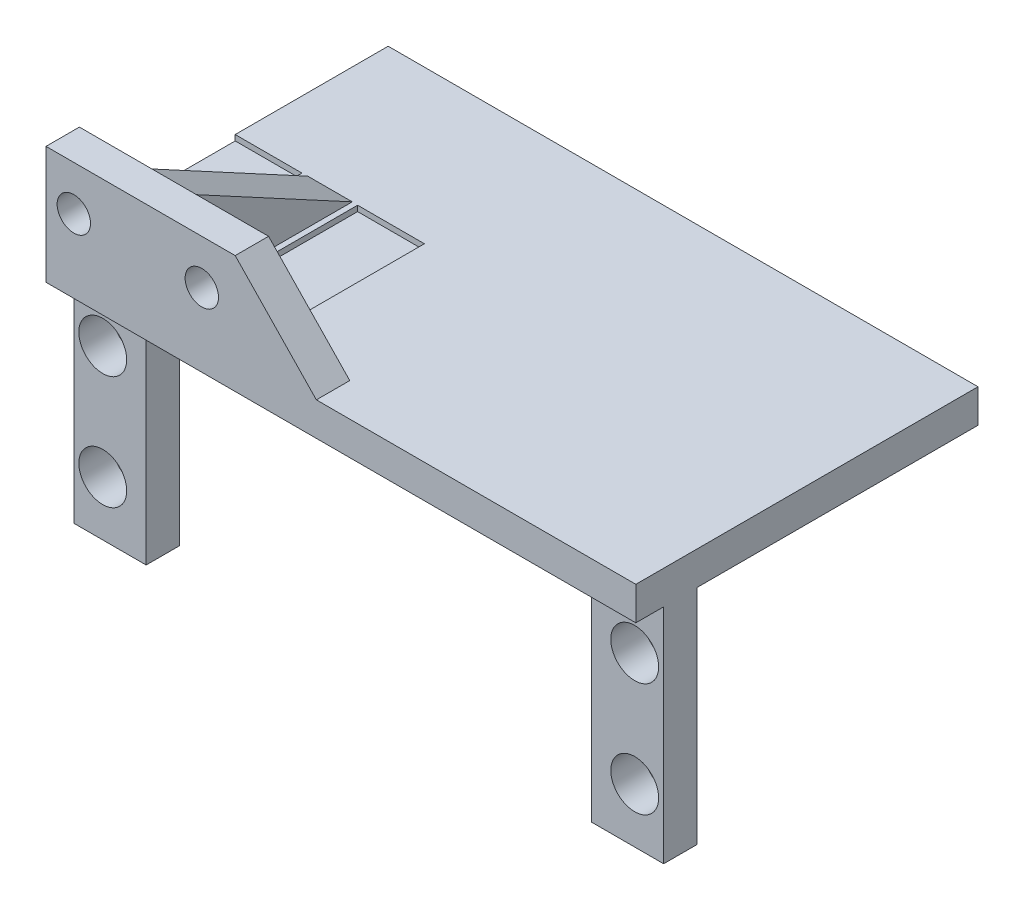
ISO-10303-21;
HEADER;
FILE_DESCRIPTION(('STEP AP214'),'2;1');
FILE_NAME('part.step','',(''),(''),'','','');
FILE_SCHEMA(('AUTOMOTIVE_DESIGN { 1 0 10303 214 1 1 1 1 }'));
ENDSEC;
DATA;
#1=APPLICATION_CONTEXT('core data for automotive mechanical design processes');
#2=APPLICATION_PROTOCOL_DEFINITION('international standard','automotive_design',2000,#1);
#3=PRODUCT_CONTEXT('',#1,'mechanical');
#4=PRODUCT('Part','Part','',(#3));
#5=PRODUCT_RELATED_PRODUCT_CATEGORY('part','',(#4));
#6=PRODUCT_DEFINITION_FORMATION('','',#4);
#7=PRODUCT_DEFINITION_CONTEXT('part definition',#1,'design');
#8=PRODUCT_DEFINITION('design','',#6,#7);
#9=PRODUCT_DEFINITION_SHAPE('','',#8);
#10=(LENGTH_UNIT() NAMED_UNIT(*) SI_UNIT(.MILLI.,.METRE.));
#11=(NAMED_UNIT(*) PLANE_ANGLE_UNIT() SI_UNIT($,.RADIAN.));
#12=(NAMED_UNIT(*) SI_UNIT($,.STERADIAN.) SOLID_ANGLE_UNIT());
#13=UNCERTAINTY_MEASURE_WITH_UNIT(LENGTH_MEASURE(1.E-05),#10,'distance_accuracy_value','');
#14=(GEOMETRIC_REPRESENTATION_CONTEXT(3) GLOBAL_UNCERTAINTY_ASSIGNED_CONTEXT((#13)) GLOBAL_UNIT_ASSIGNED_CONTEXT((#10,
#11,#12)) REPRESENTATION_CONTEXT('',''));
#15=CARTESIAN_POINT('',(0.,0.,0.));
#16=DIRECTION('',(0.,0.,1.));
#17=DIRECTION('',(1.,0.,0.));
#18=AXIS2_PLACEMENT_3D('',#15,#16,#17);
#19=CARTESIAN_POINT('',(0.,3.,0.));
#20=DIRECTION('',(0.,1.,0.));
#21=DIRECTION('',(0.,0.,1.));
#22=AXIS2_PLACEMENT_3D('',#19,#20,#21);
#23=PLANE('',#22);
#24=DIRECTION('',(0.,0.,1.));
#25=VECTOR('',#24,1.);
#26=CARTESIAN_POINT('',(21.9121082102589,3.,34.4908925903216));
#27=LINE('',#26,#25);
#28=CARTESIAN_POINT('',(21.9121082102589,3.,34.4908925903216));
#29=VERTEX_POINT('',#28);
#30=CARTESIAN_POINT('',(21.9121082102589,3.,37.4908925903216));
#31=VERTEX_POINT('',#30);
#32=EDGE_CURVE('E55',#29,#31,#27,.T.);
#33=ORIENTED_EDGE('',*,*,#32,.T.);
#34=DIRECTION('',(1.,0.,0.));
#35=VECTOR('',#34,1.);
#36=CARTESIAN_POINT('',(-2.38191084480889,3.,37.4908925903216));
#37=LINE('',#36,#35);
#38=CARTESIAN_POINT('',(50.6180891551911,3.,37.4908925903216));
#39=VERTEX_POINT('',#38);
#40=EDGE_CURVE('E403',#31,#39,#37,.T.);
#41=ORIENTED_EDGE('',*,*,#40,.T.);
#42=DIRECTION('',(0.,0.,-1.));
#43=VECTOR('',#42,1.);
#44=CARTESIAN_POINT('',(50.6180891551911,3.,6.74530636270987));
#45=LINE('',#44,#43);
#46=CARTESIAN_POINT('',(50.6180891551911,3.,6.74530636270987));
#47=VERTEX_POINT('',#46);
#48=EDGE_CURVE('E406',#39,#47,#45,.T.);
#49=ORIENTED_EDGE('',*,*,#48,.T.);
#50=DIRECTION('',(-1.,0.,0.));
#51=VECTOR('',#50,1.);
#52=CARTESIAN_POINT('',(-2.3819108448089,3.,6.74530636270987));
#53=LINE('',#52,#51);
#54=CARTESIAN_POINT('',(-2.3819108448089,3.,6.74530636270987));
#55=VERTEX_POINT('',#54);
#56=EDGE_CURVE('E408',#47,#55,#53,.T.);
#57=ORIENTED_EDGE('',*,*,#56,.T.);
#58=DIRECTION('',(0.,0.,1.));
#59=VECTOR('',#58,1.);
#60=CARTESIAN_POINT('',(-2.3819108448089,3.,6.74530636270987));
#61=LINE('',#60,#59);
#62=CARTESIAN_POINT('',(-2.3819108448089,3.,20.4908925903216));
#63=VERTEX_POINT('',#62);
#64=EDGE_CURVE('E400',#55,#63,#61,.T.);
#65=ORIENTED_EDGE('',*,*,#64,.T.);
#66=DIRECTION('',(1.,0.,0.));
#67=VECTOR('',#66,1.);
#68=CARTESIAN_POINT('',(0.,3.,20.4908925903216));
#69=LINE('',#68,#67);
#70=CARTESIAN_POINT('',(3.6180891551911,3.,20.4908925903216));
#71=VERTEX_POINT('',#70);
#72=EDGE_CURVE('E289',#63,#71,#69,.T.);
#73=ORIENTED_EDGE('',*,*,#72,.T.);
#74=DIRECTION('',(0.,0.,-1.));
#75=VECTOR('',#74,1.);
#76=CARTESIAN_POINT('',(3.6180891551911,3.,0.));
#77=LINE('',#76,#75);
#78=CARTESIAN_POINT('',(3.6180891551911,3.,34.4908925903216));
#79=VERTEX_POINT('',#78);
#80=EDGE_CURVE('E252',#79,#71,#77,.T.);
#81=ORIENTED_EDGE('',*,*,#80,.F.);
#82=DIRECTION('',(1.,0.,0.));
#83=VECTOR('',#82,1.);
#84=CARTESIAN_POINT('',(-2.38191084480889,3.,34.4908925903216));
#85=LINE('',#84,#83);
#86=CARTESIAN_POINT('',(4.11808915519111,3.,34.4908925903216));
#87=VERTEX_POINT('',#86);
#88=EDGE_CURVE('E215',#79,#87,#85,.T.);
#89=ORIENTED_EDGE('',*,*,#88,.T.);
#90=DIRECTION('',(0.,0.,1.));
#91=VECTOR('',#90,1.);
#92=CARTESIAN_POINT('',(4.11808915519111,3.,34.4908925903216));
#93=LINE('',#92,#91);
#94=CARTESIAN_POINT('',(4.1180891551911,3.,20.4689209894298));
#95=VERTEX_POINT('',#94);
#96=EDGE_CURVE('E236',#95,#87,#93,.T.);
#97=ORIENTED_EDGE('',*,*,#96,.F.);
#98=DIRECTION('',(-1.,0.,0.));
#99=VECTOR('',#98,1.);
#100=CARTESIAN_POINT('',(8.11808915519111,3.,20.4689209894298));
#101=LINE('',#100,#99);
#102=CARTESIAN_POINT('',(8.11808915519111,3.,20.4689209894298));
#103=VERTEX_POINT('',#102);
#104=EDGE_CURVE('E248',#103,#95,#101,.T.);
#105=ORIENTED_EDGE('',*,*,#104,.F.);
#106=DIRECTION('',(0.,0.,1.));
#107=VECTOR('',#106,1.);
#108=CARTESIAN_POINT('',(8.11808915519111,3.,34.4908925903216));
#109=LINE('',#108,#107);
#110=CARTESIAN_POINT('',(8.11808915519111,3.,34.4908925903216));
#111=VERTEX_POINT('',#110);
#112=EDGE_CURVE('E243',#103,#111,#109,.T.);
#113=ORIENTED_EDGE('',*,*,#112,.T.);
#114=CARTESIAN_POINT('',(8.61808915519111,3.,34.4908925903216));
#115=VERTEX_POINT('',#114);
#116=EDGE_CURVE('E314',#111,#115,#85,.T.);
#117=ORIENTED_EDGE('',*,*,#116,.T.);
#118=DIRECTION('',(0.,0.,-1.));
#119=VECTOR('',#118,1.);
#120=CARTESIAN_POINT('',(8.61808915519111,3.,0.));
#121=LINE('',#120,#119);
#122=CARTESIAN_POINT('',(8.61808915519111,3.,20.4908925903216));
#123=VERTEX_POINT('',#122);
#124=EDGE_CURVE('E267',#115,#123,#121,.T.);
#125=ORIENTED_EDGE('',*,*,#124,.T.);
#126=DIRECTION('',(-1.,0.,0.));
#127=VECTOR('',#126,1.);
#128=CARTESIAN_POINT('',(0.,3.,20.4908925903216));
#129=LINE('',#128,#127);
#130=CARTESIAN_POINT('',(14.6180891551911,3.,20.4908925903216));
#131=VERTEX_POINT('',#130);
#132=EDGE_CURVE('E257',#131,#123,#129,.T.);
#133=ORIENTED_EDGE('',*,*,#132,.F.);
#134=DIRECTION('',(0.,0.,-1.));
#135=VECTOR('',#134,1.);
#136=CARTESIAN_POINT('',(14.6180891551911,3.,0.));
#137=LINE('',#136,#135);
#138=CARTESIAN_POINT('',(14.6180891551911,3.,34.4908925903216));
#139=VERTEX_POINT('',#138);
#140=EDGE_CURVE('E270',#139,#131,#137,.T.);
#141=ORIENTED_EDGE('',*,*,#140,.F.);
#142=DIRECTION('',(1.,0.,0.));
#143=VECTOR('',#142,1.);
#144=CARTESIAN_POINT('',(14.6180891551911,3.,34.4908925903216));
#145=LINE('',#144,#143);
#146=EDGE_CURVE('E51',#139,#29,#145,.T.);
#147=ORIENTED_EDGE('',*,*,#146,.T.);
#148=EDGE_LOOP('',(#33,#41,#49,#57,#65,#73,#81,#89,#97,#105,#113,#117,#125,#133,#141,#147));
#149=FACE_BOUND('',#148,.T.);
#150=ADVANCED_FACE('F34',(#149),#23,.T.);
#151=CARTESIAN_POINT('',(0.,0.,0.));
#152=DIRECTION('',(0.,1.,0.));
#153=DIRECTION('',(0.,0.,1.));
#154=AXIS2_PLACEMENT_3D('',#151,#152,#153);
#155=PLANE('',#154);
#156=DIRECTION('',(-1.,0.,0.));
#157=VECTOR('',#156,1.);
#158=CARTESIAN_POINT('',(4.11808915519112,0.,34.9908925903216));
#159=LINE('',#158,#157);
#160=CARTESIAN_POINT('',(4.11808915519112,0.,34.9908925903216));
#161=VERTEX_POINT('',#160);
#162=CARTESIAN_POINT('',(-2.38191084480889,0.,34.9908925903216));
#163=VERTEX_POINT('',#162);
#164=EDGE_CURVE('E357',#161,#163,#159,.T.);
#165=ORIENTED_EDGE('',*,*,#164,.F.);
#166=DIRECTION('',(0.,0.,1.));
#167=VECTOR('',#166,1.);
#168=CARTESIAN_POINT('',(4.11808915519112,0.,34.9908925903216));
#169=LINE('',#168,#167);
#170=CARTESIAN_POINT('',(4.11808915519112,0.,31.9908925903216));
#171=VERTEX_POINT('',#170);
#172=EDGE_CURVE('E341',#171,#161,#169,.T.);
#173=ORIENTED_EDGE('',*,*,#172,.F.);
#174=DIRECTION('',(1.,0.,0.));
#175=VECTOR('',#174,1.);
#176=CARTESIAN_POINT('',(4.11808915519112,0.,31.9908925903216));
#177=LINE('',#176,#175);
#178=CARTESIAN_POINT('',(-2.38191084480889,0.,31.9908925903216));
#179=VERTEX_POINT('',#178);
#180=EDGE_CURVE('E348',#179,#171,#177,.T.);
#181=ORIENTED_EDGE('',*,*,#180,.F.);
#182=DIRECTION('',(0.,0.,1.));
#183=VECTOR('',#182,1.);
#184=CARTESIAN_POINT('',(-2.3819108448089,0.,6.74530636270987));
#185=LINE('',#184,#183);
#186=CARTESIAN_POINT('',(-2.3819108448089,0.,6.74530636270987));
#187=VERTEX_POINT('',#186);
#188=EDGE_CURVE('E411',#187,#179,#185,.T.);
#189=ORIENTED_EDGE('',*,*,#188,.F.);
#190=DIRECTION('',(-1.,0.,0.));
#191=VECTOR('',#190,1.);
#192=CARTESIAN_POINT('',(-2.3819108448089,0.,6.74530636270987));
#193=LINE('',#192,#191);
#194=CARTESIAN_POINT('',(50.6180891551911,0.,6.74530636270987));
#195=VERTEX_POINT('',#194);
#196=EDGE_CURVE('E404',#195,#187,#193,.T.);
#197=ORIENTED_EDGE('',*,*,#196,.F.);
#198=DIRECTION('',(0.,0.,-1.));
#199=VECTOR('',#198,1.);
#200=CARTESIAN_POINT('',(50.6180891551911,0.,6.74530636270987));
#201=LINE('',#200,#199);
#202=CARTESIAN_POINT('',(50.6180891551911,0.,31.9908925903216));
#203=VERTEX_POINT('',#202);
#204=EDGE_CURVE('E416',#203,#195,#201,.T.);
#205=ORIENTED_EDGE('',*,*,#204,.F.);
#206=DIRECTION('',(1.,0.,0.));
#207=VECTOR('',#206,1.);
#208=CARTESIAN_POINT('',(50.6180891551911,0.,31.9908925903216));
#209=LINE('',#208,#207);
#210=CARTESIAN_POINT('',(44.1180891551911,0.,31.9908925903216));
#211=VERTEX_POINT('',#210);
#212=EDGE_CURVE('E374',#211,#203,#209,.T.);
#213=ORIENTED_EDGE('',*,*,#212,.F.);
#214=DIRECTION('',(0.,0.,-1.));
#215=VECTOR('',#214,1.);
#216=CARTESIAN_POINT('',(44.1180891551911,0.,34.9908925903216));
#217=LINE('',#216,#215);
#218=CARTESIAN_POINT('',(44.1180891551911,0.,34.9908925903216));
#219=VERTEX_POINT('',#218);
#220=EDGE_CURVE('E383',#219,#211,#217,.T.);
#221=ORIENTED_EDGE('',*,*,#220,.F.);
#222=DIRECTION('',(-1.,0.,0.));
#223=VECTOR('',#222,1.);
#224=CARTESIAN_POINT('',(50.6180891551911,0.,34.9908925903216));
#225=LINE('',#224,#223);
#226=CARTESIAN_POINT('',(50.6180891551911,0.,34.9908925903216));
#227=VERTEX_POINT('',#226);
#228=EDGE_CURVE('E369',#227,#219,#225,.T.);
#229=ORIENTED_EDGE('',*,*,#228,.F.);
#230=CARTESIAN_POINT('',(50.6180891551911,0.,37.4908925903216));
#231=VERTEX_POINT('',#230);
#232=EDGE_CURVE('E417',#231,#227,#201,.T.);
#233=ORIENTED_EDGE('',*,*,#232,.F.);
#234=DIRECTION('',(1.,0.,0.));
#235=VECTOR('',#234,1.);
#236=CARTESIAN_POINT('',(-2.38191084480889,0.,37.4908925903216));
#237=LINE('',#236,#235);
#238=CARTESIAN_POINT('',(-2.38191084480889,0.,37.4908925903216));
#239=VERTEX_POINT('',#238);
#240=EDGE_CURVE('E414',#239,#231,#237,.T.);
#241=ORIENTED_EDGE('',*,*,#240,.F.);
#242=EDGE_CURVE('E399',#163,#239,#185,.T.);
#243=ORIENTED_EDGE('',*,*,#242,.F.);
#244=EDGE_LOOP('',(#165,#173,#181,#189,#197,#205,#213,#221,#229,#233,#241,#243));
#245=FACE_BOUND('',#244,.T.);
#246=ADVANCED_FACE('F447',(#245),#155,.F.);
#247=CARTESIAN_POINT('',(-2.3819108448089,3.,6.74530636270987));
#248=DIRECTION('',(1.,0.,0.));
#249=DIRECTION('',(0.,0.,-1.));
#250=AXIS2_PLACEMENT_3D('',#247,#248,#249);
#251=PLANE('',#250);
#252=DIRECTION('',(0.,-1.,0.));
#253=VECTOR('',#252,1.);
#254=CARTESIAN_POINT('',(-2.38191084480889,3.,34.4908925903216));
#255=LINE('',#254,#253);
#256=CARTESIAN_POINT('',(-2.38191084480889,10.58,34.4908925903216));
#257=VERTEX_POINT('',#256);
#258=CARTESIAN_POINT('',(-2.38191084480889,2.5,34.4908925903216));
#259=VERTEX_POINT('',#258);
#260=EDGE_CURVE('E211',#257,#259,#255,.T.);
#261=ORIENTED_EDGE('',*,*,#260,.T.);
#262=DIRECTION('',(0.,0.,1.));
#263=VECTOR('',#262,1.);
#264=CARTESIAN_POINT('',(-2.3819108448089,2.5,0.));
#265=LINE('',#264,#263);
#266=CARTESIAN_POINT('',(-2.3819108448089,2.5,20.4908925903216));
#267=VERTEX_POINT('',#266);
#268=EDGE_CURVE('E294',#267,#259,#265,.T.);
#269=ORIENTED_EDGE('',*,*,#268,.F.);
#270=DIRECTION('',(0.,1.,0.));
#271=VECTOR('',#270,1.);
#272=CARTESIAN_POINT('',(-2.3819108448089,2.5,20.4908925903216));
#273=LINE('',#272,#271);
#274=EDGE_CURVE('E271',#267,#63,#273,.T.);
#275=ORIENTED_EDGE('',*,*,#274,.T.);
#276=ORIENTED_EDGE('',*,*,#64,.F.);
#277=DIRECTION('',(0.,-1.,0.));
#278=VECTOR('',#277,1.);
#279=CARTESIAN_POINT('',(-2.3819108448089,3.,6.74530636270987));
#280=LINE('',#279,#278);
#281=EDGE_CURVE('E410',#55,#187,#280,.T.);
#282=ORIENTED_EDGE('',*,*,#281,.T.);
#283=ORIENTED_EDGE('',*,*,#188,.T.);
#284=DIRECTION('',(0.,1.,0.));
#285=VECTOR('',#284,1.);
#286=CARTESIAN_POINT('',(-2.38191084480889,-20.,31.9908925903216));
#287=LINE('',#286,#285);
#288=CARTESIAN_POINT('',(-2.38191084480889,-20.,31.9908925903216));
#289=VERTEX_POINT('',#288);
#290=EDGE_CURVE('E363',#289,#179,#287,.T.);
#291=ORIENTED_EDGE('',*,*,#290,.F.);
#292=DIRECTION('',(0.,0.,-1.));
#293=VECTOR('',#292,1.);
#294=CARTESIAN_POINT('',(-2.38191084480889,-20.,34.9908925903216));
#295=LINE('',#294,#293);
#296=CARTESIAN_POINT('',(-2.38191084480889,-20.,34.9908925903216));
#297=VERTEX_POINT('',#296);
#298=EDGE_CURVE('E350',#297,#289,#295,.T.);
#299=ORIENTED_EDGE('',*,*,#298,.F.);
#300=DIRECTION('',(0.,1.,0.));
#301=VECTOR('',#300,1.);
#302=CARTESIAN_POINT('',(-2.38191084480889,-20.,34.9908925903216));
#303=LINE('',#302,#301);
#304=EDGE_CURVE('E365',#297,#163,#303,.T.);
#305=ORIENTED_EDGE('',*,*,#304,.T.);
#306=ORIENTED_EDGE('',*,*,#242,.T.);
#307=DIRECTION('',(0.,-1.,0.));
#308=VECTOR('',#307,1.);
#309=CARTESIAN_POINT('',(-2.38191084480889,3.,37.4908925903216));
#310=LINE('',#309,#308);
#311=CARTESIAN_POINT('',(-2.38191084480889,10.58,37.4908925903216));
#312=VERTEX_POINT('',#311);
#313=EDGE_CURVE('E11',#312,#239,#310,.T.);
#314=ORIENTED_EDGE('',*,*,#313,.F.);
#315=DIRECTION('',(0.,0.,1.));
#316=VECTOR('',#315,1.);
#317=CARTESIAN_POINT('',(-2.38191084480889,10.58,34.4908925903216));
#318=LINE('',#317,#316);
#319=EDGE_CURVE('E224',#257,#312,#318,.T.);
#320=ORIENTED_EDGE('',*,*,#319,.F.);
#321=EDGE_LOOP('',(#261,#269,#275,#276,#282,#283,#291,#299,#305,#306,#314,#320));
#322=FACE_BOUND('',#321,.T.);
#323=ADVANCED_FACE('F36',(#322),#251,.F.);
#324=CARTESIAN_POINT('',(-2.38191084480889,3.,37.4908925903216));
#325=DIRECTION('',(0.,0.,-1.));
#326=DIRECTION('',(-1.,0.,0.));
#327=AXIS2_PLACEMENT_3D('',#324,#325,#326);
#328=PLANE('',#327);
#329=ORIENTED_EDGE('',*,*,#40,.F.);
#330=DIRECTION('',(-0.693383174984069,0.72056906167904,0.));
#331=VECTOR('',#330,1.);
#332=CARTESIAN_POINT('',(21.9121082102589,3.,37.4908925903216));
#333=LINE('',#332,#331);
#334=CARTESIAN_POINT('',(14.6180891551911,10.58,37.4908925903216));
#335=VERTEX_POINT('',#334);
#336=EDGE_CURVE('E230',#31,#335,#333,.T.);
#337=ORIENTED_EDGE('',*,*,#336,.T.);
#338=DIRECTION('',(-1.,0.,0.));
#339=VECTOR('',#338,1.);
#340=CARTESIAN_POINT('',(-2.38191084480889,10.58,37.4908925903216));
#341=LINE('',#340,#339);
#342=EDGE_CURVE('E220',#335,#312,#341,.T.);
#343=ORIENTED_EDGE('',*,*,#342,.T.);
#344=ORIENTED_EDGE('',*,*,#313,.T.);
#345=ORIENTED_EDGE('',*,*,#240,.T.);
#346=DIRECTION('',(0.,-1.,0.));
#347=VECTOR('',#346,1.);
#348=CARTESIAN_POINT('',(50.6180891551911,3.,37.4908925903216));
#349=LINE('',#348,#347);
#350=EDGE_CURVE('E43',#39,#231,#349,.T.);
#351=ORIENTED_EDGE('',*,*,#350,.F.);
#352=EDGE_LOOP('',(#329,#337,#343,#344,#345,#351));
#353=FACE_BOUND('',#352,.T.);
#354=CARTESIAN_POINT('',(0.118089155191028,6.58,37.4908925903216));
#355=DIRECTION('',(0.,0.,1.));
#356=DIRECTION('',(1.,0.,0.));
#357=AXIS2_PLACEMENT_3D('',#354,#355,#356);
#358=CIRCLE('',#357,1.5);
#359=CARTESIAN_POINT('',(1.61808915519103,6.58,37.4908925903216));
#360=VERTEX_POINT('',#359);
#361=EDGE_CURVE('E307',#360,#360,#358,.T.);
#362=ORIENTED_EDGE('',*,*,#361,.F.);
#363=EDGE_LOOP('',(#362));
#364=FACE_BOUND('',#363,.T.);
#365=CARTESIAN_POINT('',(11.618089155191,6.58,37.4908925903216));
#366=DIRECTION('',(0.,0.,1.));
#367=DIRECTION('',(1.,0.,0.));
#368=AXIS2_PLACEMENT_3D('',#365,#366,#367);
#369=CIRCLE('',#368,1.5);
#370=CARTESIAN_POINT('',(13.118089155191,6.58,37.4908925903216));
#371=VERTEX_POINT('',#370);
#372=EDGE_CURVE('E278',#371,#371,#369,.T.);
#373=ORIENTED_EDGE('',*,*,#372,.F.);
#374=EDGE_LOOP('',(#373));
#375=FACE_BOUND('',#374,.T.);
#376=ADVANCED_FACE('F464',(#353,#364,#375),#328,.F.);
#377=CARTESIAN_POINT('',(50.6180891551911,3.,6.74530636270987));
#378=DIRECTION('',(-1.,0.,0.));
#379=DIRECTION('',(0.,0.,1.));
#380=AXIS2_PLACEMENT_3D('',#377,#378,#379);
#381=PLANE('',#380);
#382=ORIENTED_EDGE('',*,*,#232,.T.);
#383=DIRECTION('',(0.,1.,0.));
#384=VECTOR('',#383,1.);
#385=CARTESIAN_POINT('',(50.6180891551911,-20.,34.9908925903216));
#386=LINE('',#385,#384);
#387=CARTESIAN_POINT('',(50.6180891551911,-20.,34.9908925903216));
#388=VERTEX_POINT('',#387);
#389=EDGE_CURVE('E396',#388,#227,#386,.T.);
#390=ORIENTED_EDGE('',*,*,#389,.F.);
#391=DIRECTION('',(0.,0.,1.));
#392=VECTOR('',#391,1.);
#393=CARTESIAN_POINT('',(50.6180891551911,-20.,34.9908925903216));
#394=LINE('',#393,#392);
#395=CARTESIAN_POINT('',(50.6180891551911,-20.,31.9908925903216));
#396=VERTEX_POINT('',#395);
#397=EDGE_CURVE('E370',#396,#388,#394,.T.);
#398=ORIENTED_EDGE('',*,*,#397,.F.);
#399=DIRECTION('',(0.,1.,0.));
#400=VECTOR('',#399,1.);
#401=CARTESIAN_POINT('',(50.6180891551911,-20.,31.9908925903216));
#402=LINE('',#401,#400);
#403=EDGE_CURVE('E380',#396,#203,#402,.T.);
#404=ORIENTED_EDGE('',*,*,#403,.T.);
#405=ORIENTED_EDGE('',*,*,#204,.T.);
#406=DIRECTION('',(0.,-1.,0.));
#407=VECTOR('',#406,1.);
#408=CARTESIAN_POINT('',(50.6180891551911,3.,6.74530636270987));
#409=LINE('',#408,#407);
#410=EDGE_CURVE('E423',#47,#195,#409,.T.);
#411=ORIENTED_EDGE('',*,*,#410,.F.);
#412=ORIENTED_EDGE('',*,*,#48,.F.);
#413=ORIENTED_EDGE('',*,*,#350,.T.);
#414=EDGE_LOOP('',(#382,#390,#398,#404,#405,#411,#412,#413));
#415=FACE_BOUND('',#414,.T.);
#416=ADVANCED_FACE('F461',(#415),#381,.F.);
#417=CARTESIAN_POINT('',(-2.3819108448089,3.,6.74530636270987));
#418=DIRECTION('',(0.,0.,1.));
#419=DIRECTION('',(1.,0.,0.));
#420=AXIS2_PLACEMENT_3D('',#417,#418,#419);
#421=PLANE('',#420);
#422=ORIENTED_EDGE('',*,*,#196,.T.);
#423=ORIENTED_EDGE('',*,*,#281,.F.);
#424=ORIENTED_EDGE('',*,*,#56,.F.);
#425=ORIENTED_EDGE('',*,*,#410,.T.);
#426=EDGE_LOOP('',(#422,#423,#424,#425));
#427=FACE_BOUND('',#426,.T.);
#428=ADVANCED_FACE('F458',(#427),#421,.F.);
#429=CARTESIAN_POINT('',(50.6180891551911,-20.,34.9908925903216));
#430=DIRECTION('',(0.,0.,-1.));
#431=DIRECTION('',(-1.,0.,0.));
#432=AXIS2_PLACEMENT_3D('',#429,#430,#431);
#433=PLANE('',#432);
#434=CARTESIAN_POINT('',(48.0180891551911,-4.90000000000001,34.9908925903216));
#435=DIRECTION('',(0.,0.,1.));
#436=DIRECTION('',(1.,0.,0.));
#437=AXIS2_PLACEMENT_3D('',#434,#435,#436);
#438=CIRCLE('',#437,2.15);
#439=CARTESIAN_POINT('',(50.1680891551911,-4.90000000000001,34.9908925903216));
#440=VERTEX_POINT('',#439);
#441=EDGE_CURVE('E330',#440,#440,#438,.T.);
#442=ORIENTED_EDGE('',*,*,#441,.F.);
#443=EDGE_LOOP('',(#442));
#444=FACE_BOUND('',#443,.T.);
#445=CARTESIAN_POINT('',(48.0180891551911,-15.1,34.9908925903216));
#446=DIRECTION('',(0.,0.,1.));
#447=DIRECTION('',(1.,0.,0.));
#448=AXIS2_PLACEMENT_3D('',#445,#446,#447);
#449=CIRCLE('',#448,2.15);
#450=CARTESIAN_POINT('',(50.1680891551911,-15.1,34.9908925903216));
#451=VERTEX_POINT('',#450);
#452=EDGE_CURVE('E329',#451,#451,#449,.T.);
#453=ORIENTED_EDGE('',*,*,#452,.F.);
#454=EDGE_LOOP('',(#453));
#455=FACE_BOUND('',#454,.T.);
#456=ORIENTED_EDGE('',*,*,#228,.T.);
#457=DIRECTION('',(0.,1.,0.));
#458=VECTOR('',#457,1.);
#459=CARTESIAN_POINT('',(44.1180891551911,-20.,34.9908925903216));
#460=LINE('',#459,#458);
#461=CARTESIAN_POINT('',(44.1180891551911,-20.,34.9908925903216));
#462=VERTEX_POINT('',#461);
#463=EDGE_CURVE('E393',#462,#219,#460,.T.);
#464=ORIENTED_EDGE('',*,*,#463,.F.);
#465=DIRECTION('',(-1.,0.,0.));
#466=VECTOR('',#465,1.);
#467=CARTESIAN_POINT('',(50.6180891551911,-20.,34.9908925903216));
#468=LINE('',#467,#466);
#469=EDGE_CURVE('E373',#388,#462,#468,.T.);
#470=ORIENTED_EDGE('',*,*,#469,.F.);
#471=ORIENTED_EDGE('',*,*,#389,.T.);
#472=EDGE_LOOP('',(#456,#464,#470,#471));
#473=FACE_BOUND('',#472,.T.);
#474=ADVANCED_FACE('F455',(#444,#455,#473),#433,.F.);
#475=CARTESIAN_POINT('',(44.1180891551911,-20.,34.9908925903216));
#476=DIRECTION('',(1.,0.,0.));
#477=DIRECTION('',(0.,0.,-1.));
#478=AXIS2_PLACEMENT_3D('',#475,#476,#477);
#479=PLANE('',#478);
#480=ORIENTED_EDGE('',*,*,#220,.T.);
#481=DIRECTION('',(0.,1.,0.));
#482=VECTOR('',#481,1.);
#483=CARTESIAN_POINT('',(44.1180891551911,-20.,31.9908925903216));
#484=LINE('',#483,#482);
#485=CARTESIAN_POINT('',(44.1180891551911,-20.,31.9908925903216));
#486=VERTEX_POINT('',#485);
#487=EDGE_CURVE('E390',#486,#211,#484,.T.);
#488=ORIENTED_EDGE('',*,*,#487,.F.);
#489=DIRECTION('',(0.,0.,-1.));
#490=VECTOR('',#489,1.);
#491=CARTESIAN_POINT('',(44.1180891551911,-20.,34.9908925903216));
#492=LINE('',#491,#490);
#493=EDGE_CURVE('E376',#462,#486,#492,.T.);
#494=ORIENTED_EDGE('',*,*,#493,.F.);
#495=ORIENTED_EDGE('',*,*,#463,.T.);
#496=EDGE_LOOP('',(#480,#488,#494,#495));
#497=FACE_BOUND('',#496,.T.);
#498=ADVANCED_FACE('F663',(#497),#479,.F.);
#499=CARTESIAN_POINT('',(50.6180891551911,-20.,31.9908925903216));
#500=DIRECTION('',(0.,0.,1.));
#501=DIRECTION('',(1.,0.,0.));
#502=AXIS2_PLACEMENT_3D('',#499,#500,#501);
#503=PLANE('',#502);
#504=CARTESIAN_POINT('',(48.0180891551911,-4.90000000000001,31.9908925903216));
#505=DIRECTION('',(0.,0.,1.));
#506=DIRECTION('',(1.,0.,0.));
#507=AXIS2_PLACEMENT_3D('',#504,#505,#506);
#508=CIRCLE('',#507,2.15);
#509=CARTESIAN_POINT('',(50.1680891551911,-4.90000000000001,31.9908925903216));
#510=VERTEX_POINT('',#509);
#511=EDGE_CURVE('E326',#510,#510,#508,.T.);
#512=ORIENTED_EDGE('',*,*,#511,.T.);
#513=EDGE_LOOP('',(#512));
#514=FACE_BOUND('',#513,.T.);
#515=CARTESIAN_POINT('',(48.0180891551911,-15.1,31.9908925903216));
#516=DIRECTION('',(0.,0.,1.));
#517=DIRECTION('',(1.,0.,0.));
#518=AXIS2_PLACEMENT_3D('',#515,#516,#517);
#519=CIRCLE('',#518,2.15);
#520=CARTESIAN_POINT('',(50.1680891551911,-15.1,31.9908925903216));
#521=VERTEX_POINT('',#520);
#522=EDGE_CURVE('E338',#521,#521,#519,.T.);
#523=ORIENTED_EDGE('',*,*,#522,.T.);
#524=EDGE_LOOP('',(#523));
#525=FACE_BOUND('',#524,.T.);
#526=ORIENTED_EDGE('',*,*,#212,.T.);
#527=ORIENTED_EDGE('',*,*,#403,.F.);
#528=DIRECTION('',(1.,0.,0.));
#529=VECTOR('',#528,1.);
#530=CARTESIAN_POINT('',(50.6180891551911,-20.,31.9908925903216));
#531=LINE('',#530,#529);
#532=EDGE_CURVE('E378',#486,#396,#531,.T.);
#533=ORIENTED_EDGE('',*,*,#532,.F.);
#534=ORIENTED_EDGE('',*,*,#487,.T.);
#535=EDGE_LOOP('',(#526,#527,#533,#534));
#536=FACE_BOUND('',#535,.T.);
#537=ADVANCED_FACE('F657',(#514,#525,#536),#503,.F.);
#538=CARTESIAN_POINT('',(0.,-20.,0.));
#539=DIRECTION('',(0.,1.,0.));
#540=DIRECTION('',(0.,0.,1.));
#541=AXIS2_PLACEMENT_3D('',#538,#539,#540);
#542=PLANE('',#541);
#543=ORIENTED_EDGE('',*,*,#397,.T.);
#544=ORIENTED_EDGE('',*,*,#469,.T.);
#545=ORIENTED_EDGE('',*,*,#493,.T.);
#546=ORIENTED_EDGE('',*,*,#532,.T.);
#547=EDGE_LOOP('',(#543,#544,#545,#546));
#548=FACE_BOUND('',#547,.T.);
#549=ADVANCED_FACE('F662',(#548),#542,.F.);
#550=CARTESIAN_POINT('',(4.11808915519112,-20.,34.9908925903216));
#551=DIRECTION('',(-1.,0.,0.));
#552=DIRECTION('',(0.,0.,1.));
#553=AXIS2_PLACEMENT_3D('',#550,#551,#552);
#554=PLANE('',#553);
#555=ORIENTED_EDGE('',*,*,#172,.T.);
#556=DIRECTION('',(0.,1.,0.));
#557=VECTOR('',#556,1.);
#558=CARTESIAN_POINT('',(4.11808915519112,-20.,34.9908925903216));
#559=LINE('',#558,#557);
#560=CARTESIAN_POINT('',(4.11808915519112,-20.,34.9908925903216));
#561=VERTEX_POINT('',#560);
#562=EDGE_CURVE('E367',#561,#161,#559,.T.);
#563=ORIENTED_EDGE('',*,*,#562,.F.);
#564=DIRECTION('',(0.,0.,1.));
#565=VECTOR('',#564,1.);
#566=CARTESIAN_POINT('',(4.11808915519112,-20.,34.9908925903216));
#567=LINE('',#566,#565);
#568=CARTESIAN_POINT('',(4.11808915519112,-20.,31.9908925903216));
#569=VERTEX_POINT('',#568);
#570=EDGE_CURVE('E344',#569,#561,#567,.T.);
#571=ORIENTED_EDGE('',*,*,#570,.F.);
#572=DIRECTION('',(0.,1.,0.));
#573=VECTOR('',#572,1.);
#574=CARTESIAN_POINT('',(4.11808915519112,-20.,31.9908925903216));
#575=LINE('',#574,#573);
#576=EDGE_CURVE('E354',#569,#171,#575,.T.);
#577=ORIENTED_EDGE('',*,*,#576,.T.);
#578=EDGE_LOOP('',(#555,#563,#571,#577));
#579=FACE_BOUND('',#578,.T.);
#580=ADVANCED_FACE('F649',(#579),#554,.F.);
#581=CARTESIAN_POINT('',(4.11808915519112,-20.,34.9908925903216));
#582=DIRECTION('',(0.,0.,-1.));
#583=DIRECTION('',(-1.,0.,0.));
#584=AXIS2_PLACEMENT_3D('',#581,#582,#583);
#585=PLANE('',#584);
#586=CARTESIAN_POINT('',(0.218089155191097,-15.1,34.9908925903216));
#587=DIRECTION('',(0.,0.,1.));
#588=DIRECTION('',(1.,0.,0.));
#589=AXIS2_PLACEMENT_3D('',#586,#587,#588);
#590=CIRCLE('',#589,2.15);
#591=CARTESIAN_POINT('',(2.3680891551911,-15.1,34.9908925903216));
#592=VERTEX_POINT('',#591);
#593=EDGE_CURVE('E323',#592,#592,#590,.T.);
#594=ORIENTED_EDGE('',*,*,#593,.F.);
#595=EDGE_LOOP('',(#594));
#596=FACE_BOUND('',#595,.T.);
#597=CARTESIAN_POINT('',(0.218089155191097,-4.90000000000001,34.9908925903216));
#598=DIRECTION('',(0.,0.,1.));
#599=DIRECTION('',(1.,0.,0.));
#600=AXIS2_PLACEMENT_3D('',#597,#598,#599);
#601=CIRCLE('',#600,2.15);
#602=CARTESIAN_POINT('',(2.3680891551911,-4.90000000000001,34.9908925903216));
#603=VERTEX_POINT('',#602);
#604=EDGE_CURVE('E318',#603,#603,#601,.T.);
#605=ORIENTED_EDGE('',*,*,#604,.F.);
#606=EDGE_LOOP('',(#605));
#607=FACE_BOUND('',#606,.T.);
#608=ORIENTED_EDGE('',*,*,#164,.T.);
#609=ORIENTED_EDGE('',*,*,#304,.F.);
#610=DIRECTION('',(-1.,0.,0.));
#611=VECTOR('',#610,1.);
#612=CARTESIAN_POINT('',(4.11808915519112,-20.,34.9908925903216));
#613=LINE('',#612,#611);
#614=EDGE_CURVE('E347',#561,#297,#613,.T.);
#615=ORIENTED_EDGE('',*,*,#614,.F.);
#616=ORIENTED_EDGE('',*,*,#562,.T.);
#617=EDGE_LOOP('',(#608,#609,#615,#616));
#618=FACE_BOUND('',#617,.T.);
#619=ADVANCED_FACE('F639',(#596,#607,#618),#585,.F.);
#620=CARTESIAN_POINT('',(4.11808915519112,-20.,31.9908925903216));
#621=DIRECTION('',(0.,0.,1.));
#622=DIRECTION('',(1.,0.,0.));
#623=AXIS2_PLACEMENT_3D('',#620,#621,#622);
#624=PLANE('',#623);
#625=CARTESIAN_POINT('',(0.218089155191097,-15.1,31.9908925903216));
#626=DIRECTION('',(0.,0.,1.));
#627=DIRECTION('',(1.,0.,0.));
#628=AXIS2_PLACEMENT_3D('',#625,#626,#627);
#629=CIRCLE('',#628,2.15);
#630=CARTESIAN_POINT('',(2.3680891551911,-15.1,31.9908925903216));
#631=VERTEX_POINT('',#630);
#632=EDGE_CURVE('E333',#631,#631,#629,.T.);
#633=ORIENTED_EDGE('',*,*,#632,.T.);
#634=EDGE_LOOP('',(#633));
#635=FACE_BOUND('',#634,.T.);
#636=CARTESIAN_POINT('',(0.218089155191097,-4.90000000000001,31.9908925903216));
#637=DIRECTION('',(0.,0.,1.));
#638=DIRECTION('',(1.,0.,0.));
#639=AXIS2_PLACEMENT_3D('',#636,#637,#638);
#640=CIRCLE('',#639,2.15);
#641=CARTESIAN_POINT('',(2.3680891551911,-4.90000000000001,31.9908925903216));
#642=VERTEX_POINT('',#641);
#643=EDGE_CURVE('E320',#642,#642,#640,.T.);
#644=ORIENTED_EDGE('',*,*,#643,.T.);
#645=EDGE_LOOP('',(#644));
#646=FACE_BOUND('',#645,.T.);
#647=ORIENTED_EDGE('',*,*,#180,.T.);
#648=ORIENTED_EDGE('',*,*,#576,.F.);
#649=DIRECTION('',(1.,0.,0.));
#650=VECTOR('',#649,1.);
#651=CARTESIAN_POINT('',(4.11808915519112,-20.,31.9908925903216));
#652=LINE('',#651,#650);
#653=EDGE_CURVE('E352',#289,#569,#652,.T.);
#654=ORIENTED_EDGE('',*,*,#653,.F.);
#655=ORIENTED_EDGE('',*,*,#290,.T.);
#656=EDGE_LOOP('',(#647,#648,#654,#655));
#657=FACE_BOUND('',#656,.T.);
#658=ADVANCED_FACE('F634',(#635,#646,#657),#624,.F.);
#659=CARTESIAN_POINT('',(0.,-20.,0.));
#660=DIRECTION('',(0.,1.,0.));
#661=DIRECTION('',(0.,0.,1.));
#662=AXIS2_PLACEMENT_3D('',#659,#660,#661);
#663=PLANE('',#662);
#664=ORIENTED_EDGE('',*,*,#570,.T.);
#665=ORIENTED_EDGE('',*,*,#614,.T.);
#666=ORIENTED_EDGE('',*,*,#298,.T.);
#667=ORIENTED_EDGE('',*,*,#653,.T.);
#668=EDGE_LOOP('',(#664,#665,#666,#667));
#669=FACE_BOUND('',#668,.T.);
#670=ADVANCED_FACE('F626',(#669),#663,.F.);
#671=CARTESIAN_POINT('',(0.218089155191097,-4.90000000000001,31.9908925903216));
#672=DIRECTION('',(0.,0.,1.));
#673=DIRECTION('',(1.,0.,0.));
#674=AXIS2_PLACEMENT_3D('',#671,#672,#673);
#675=CYLINDRICAL_SURFACE('',#674,2.15);
#676=ORIENTED_EDGE('',*,*,#643,.F.);
#677=EDGE_LOOP('',(#676));
#678=FACE_BOUND('',#677,.T.);
#679=ORIENTED_EDGE('',*,*,#604,.T.);
#680=EDGE_LOOP('',(#679));
#681=FACE_BOUND('',#680,.T.);
#682=ADVANCED_FACE('F616',(#678,#681),#675,.F.);
#683=CARTESIAN_POINT('',(0.218089155191097,-15.1,31.9908925903216));
#684=DIRECTION('',(0.,0.,1.));
#685=DIRECTION('',(1.,0.,0.));
#686=AXIS2_PLACEMENT_3D('',#683,#684,#685);
#687=CYLINDRICAL_SURFACE('',#686,2.15);
#688=ORIENTED_EDGE('',*,*,#632,.F.);
#689=EDGE_LOOP('',(#688));
#690=FACE_BOUND('',#689,.T.);
#691=ORIENTED_EDGE('',*,*,#593,.T.);
#692=EDGE_LOOP('',(#691));
#693=FACE_BOUND('',#692,.T.);
#694=ADVANCED_FACE('F606',(#690,#693),#687,.F.);
#695=CARTESIAN_POINT('',(48.0180891551911,-15.1,31.9908925903216));
#696=DIRECTION('',(0.,0.,1.));
#697=DIRECTION('',(1.,0.,0.));
#698=AXIS2_PLACEMENT_3D('',#695,#696,#697);
#699=CYLINDRICAL_SURFACE('',#698,2.15);
#700=ORIENTED_EDGE('',*,*,#522,.F.);
#701=EDGE_LOOP('',(#700));
#702=FACE_BOUND('',#701,.T.);
#703=ORIENTED_EDGE('',*,*,#452,.T.);
#704=EDGE_LOOP('',(#703));
#705=FACE_BOUND('',#704,.T.);
#706=ADVANCED_FACE('F596',(#702,#705),#699,.F.);
#707=CARTESIAN_POINT('',(48.0180891551911,-4.90000000000001,31.9908925903216));
#708=DIRECTION('',(0.,0.,1.));
#709=DIRECTION('',(1.,0.,0.));
#710=AXIS2_PLACEMENT_3D('',#707,#708,#709);
#711=CYLINDRICAL_SURFACE('',#710,2.15);
#712=ORIENTED_EDGE('',*,*,#511,.F.);
#713=EDGE_LOOP('',(#712));
#714=FACE_BOUND('',#713,.T.);
#715=ORIENTED_EDGE('',*,*,#441,.T.);
#716=EDGE_LOOP('',(#715));
#717=FACE_BOUND('',#716,.T.);
#718=ADVANCED_FACE('F444',(#714,#717),#711,.F.);
#719=CARTESIAN_POINT('',(-2.38191084480889,10.58,34.4908925903216));
#720=DIRECTION('',(0.,1.,0.));
#721=DIRECTION('',(0.,0.,1.));
#722=AXIS2_PLACEMENT_3D('',#719,#720,#721);
#723=PLANE('',#722);
#724=ORIENTED_EDGE('',*,*,#342,.F.);
#725=DIRECTION('',(0.,0.,1.));
#726=VECTOR('',#725,1.);
#727=CARTESIAN_POINT('',(14.6180891551911,10.58,34.4908925903216));
#728=LINE('',#727,#726);
#729=CARTESIAN_POINT('',(14.6180891551911,10.58,34.4908925903216));
#730=VERTEX_POINT('',#729);
#731=EDGE_CURVE('E214',#730,#335,#728,.T.);
#732=ORIENTED_EDGE('',*,*,#731,.F.);
#733=DIRECTION('',(-1.,0.,0.));
#734=VECTOR('',#733,1.);
#735=CARTESIAN_POINT('',(-2.38191084480889,10.58,34.4908925903216));
#736=LINE('',#735,#734);
#737=EDGE_CURVE('E203',#730,#257,#736,.T.);
#738=ORIENTED_EDGE('',*,*,#737,.T.);
#739=ORIENTED_EDGE('',*,*,#319,.T.);
#740=EDGE_LOOP('',(#724,#732,#738,#739));
#741=FACE_BOUND('',#740,.T.);
#742=ADVANCED_FACE('F218',(#741),#723,.T.);
#743=CARTESIAN_POINT('',(0.,0.,34.4908925903216));
#744=DIRECTION('',(0.,0.,-1.));
#745=DIRECTION('',(-1.,0.,0.));
#746=AXIS2_PLACEMENT_3D('',#743,#744,#745);
#747=PLANE('',#746);
#748=DIRECTION('',(0.,1.,0.));
#749=VECTOR('',#748,1.);
#750=CARTESIAN_POINT('',(8.11808915519111,10.5703339697527,34.4908925903216));
#751=LINE('',#750,#749);
#752=CARTESIAN_POINT('',(8.11808915519111,10.5703339697527,34.4908925903216));
#753=VERTEX_POINT('',#752);
#754=EDGE_CURVE('E246',#111,#753,#751,.T.);
#755=ORIENTED_EDGE('',*,*,#754,.T.);
#756=DIRECTION('',(-1.,0.,0.));
#757=VECTOR('',#756,1.);
#758=CARTESIAN_POINT('',(8.11808915519111,10.5703339697527,34.4908925903216));
#759=LINE('',#758,#757);
#760=CARTESIAN_POINT('',(4.11808915519111,10.5703339697527,34.4908925903216));
#761=VERTEX_POINT('',#760);
#762=EDGE_CURVE('E249',#753,#761,#759,.T.);
#763=ORIENTED_EDGE('',*,*,#762,.T.);
#764=DIRECTION('',(0.,1.,0.));
#765=VECTOR('',#764,1.);
#766=CARTESIAN_POINT('',(4.11808915519111,10.5703339697527,34.4908925903216));
#767=LINE('',#766,#765);
#768=EDGE_CURVE('E238',#87,#761,#767,.T.);
#769=ORIENTED_EDGE('',*,*,#768,.F.);
#770=ORIENTED_EDGE('',*,*,#88,.F.);
#771=DIRECTION('',(0.,1.,0.));
#772=VECTOR('',#771,1.);
#773=CARTESIAN_POINT('',(3.6180891551911,2.5,34.4908925903216));
#774=LINE('',#773,#772);
#775=CARTESIAN_POINT('',(3.6180891551911,2.5,34.4908925903216));
#776=VERTEX_POINT('',#775);
#777=EDGE_CURVE('E297',#776,#79,#774,.T.);
#778=ORIENTED_EDGE('',*,*,#777,.F.);
#779=DIRECTION('',(1.,0.,0.));
#780=VECTOR('',#779,1.);
#781=CARTESIAN_POINT('',(0.,2.5,34.4908925903216));
#782=LINE('',#781,#780);
#783=EDGE_CURVE('E285',#259,#776,#782,.T.);
#784=ORIENTED_EDGE('',*,*,#783,.F.);
#785=ORIENTED_EDGE('',*,*,#260,.F.);
#786=ORIENTED_EDGE('',*,*,#737,.F.);
#787=DIRECTION('',(-0.693383174984069,0.72056906167904,0.));
#788=VECTOR('',#787,1.);
#789=CARTESIAN_POINT('',(21.9121082102589,3.,34.4908925903216));
#790=LINE('',#789,#788);
#791=EDGE_CURVE('E209',#29,#730,#790,.T.);
#792=ORIENTED_EDGE('',*,*,#791,.F.);
#793=ORIENTED_EDGE('',*,*,#146,.F.);
#794=DIRECTION('',(0.,1.,0.));
#795=VECTOR('',#794,1.);
#796=CARTESIAN_POINT('',(14.6180891551911,2.5,34.4908925903216));
#797=LINE('',#796,#795);
#798=CARTESIAN_POINT('',(14.6180891551911,2.5,34.4908925903216));
#799=VERTEX_POINT('',#798);
#800=EDGE_CURVE('E281',#799,#139,#797,.T.);
#801=ORIENTED_EDGE('',*,*,#800,.F.);
#802=DIRECTION('',(1.,0.,0.));
#803=VECTOR('',#802,1.);
#804=CARTESIAN_POINT('',(0.,2.5,34.4908925903216));
#805=LINE('',#804,#803);
#806=CARTESIAN_POINT('',(8.61808915519111,2.5,34.4908925903216));
#807=VERTEX_POINT('',#806);
#808=EDGE_CURVE('E256',#807,#799,#805,.T.);
#809=ORIENTED_EDGE('',*,*,#808,.F.);
#810=DIRECTION('',(0.,1.,0.));
#811=VECTOR('',#810,1.);
#812=CARTESIAN_POINT('',(8.61808915519111,2.5,34.4908925903216));
#813=LINE('',#812,#811);
#814=EDGE_CURVE('E266',#807,#115,#813,.T.);
#815=ORIENTED_EDGE('',*,*,#814,.T.);
#816=ORIENTED_EDGE('',*,*,#116,.F.);
#817=EDGE_LOOP('',(#755,#763,#769,#770,#778,#784,#785,#786,#792,#793,#801,#809,#815,#816));
#818=FACE_BOUND('',#817,.T.);
#819=CARTESIAN_POINT('',(0.118089155191028,6.58,34.4908925903216));
#820=DIRECTION('',(0.,0.,-1.));
#821=DIRECTION('',(-1.,0.,0.));
#822=AXIS2_PLACEMENT_3D('',#819,#820,#821);
#823=CIRCLE('',#822,1.5);
#824=CARTESIAN_POINT('',(-1.38191084480897,6.58,34.4908925903216));
#825=VERTEX_POINT('',#824);
#826=EDGE_CURVE('E38',#825,#825,#823,.T.);
#827=ORIENTED_EDGE('',*,*,#826,.F.);
#828=EDGE_LOOP('',(#827));
#829=FACE_BOUND('',#828,.T.);
#830=CARTESIAN_POINT('',(11.618089155191,6.58,34.4908925903216));
#831=DIRECTION('',(0.,0.,-1.));
#832=DIRECTION('',(-1.,0.,0.));
#833=AXIS2_PLACEMENT_3D('',#830,#831,#832);
#834=CIRCLE('',#833,1.5);
#835=CARTESIAN_POINT('',(10.118089155191,6.58,34.4908925903216));
#836=VERTEX_POINT('',#835);
#837=EDGE_CURVE('E310',#836,#836,#834,.T.);
#838=ORIENTED_EDGE('',*,*,#837,.F.);
#839=EDGE_LOOP('',(#838));
#840=FACE_BOUND('',#839,.T.);
#841=ADVANCED_FACE('F206',(#818,#829,#840),#747,.T.);
#842=CARTESIAN_POINT('',(11.618089155191,6.58,29.9908925903216));
#843=DIRECTION('',(0.,0.,1.));
#844=DIRECTION('',(1.,0.,0.));
#845=AXIS2_PLACEMENT_3D('',#842,#843,#844);
#846=CYLINDRICAL_SURFACE('',#845,1.5);
#847=ORIENTED_EDGE('',*,*,#837,.T.);
#848=EDGE_LOOP('',(#847));
#849=FACE_BOUND('',#848,.T.);
#850=ORIENTED_EDGE('',*,*,#372,.T.);
#851=EDGE_LOOP('',(#850));
#852=FACE_BOUND('',#851,.T.);
#853=ADVANCED_FACE('F437',(#849,#852),#846,.F.);
#854=CARTESIAN_POINT('',(0.118089155191028,6.58,29.9908925903216));
#855=DIRECTION('',(0.,0.,1.));
#856=DIRECTION('',(1.,0.,0.));
#857=AXIS2_PLACEMENT_3D('',#854,#855,#856);
#858=CYLINDRICAL_SURFACE('',#857,1.5);
#859=ORIENTED_EDGE('',*,*,#826,.T.);
#860=EDGE_LOOP('',(#859));
#861=FACE_BOUND('',#860,.T.);
#862=ORIENTED_EDGE('',*,*,#361,.T.);
#863=EDGE_LOOP('',(#862));
#864=FACE_BOUND('',#863,.T.);
#865=ADVANCED_FACE('F433',(#861,#864),#858,.F.);
#866=CARTESIAN_POINT('',(0.,2.5,20.4908925903216));
#867=DIRECTION('',(0.,0.,1.));
#868=DIRECTION('',(1.,0.,0.));
#869=AXIS2_PLACEMENT_3D('',#866,#867,#868);
#870=PLANE('',#869);
#871=ORIENTED_EDGE('',*,*,#72,.F.);
#872=ORIENTED_EDGE('',*,*,#274,.F.);
#873=DIRECTION('',(1.,0.,0.));
#874=VECTOR('',#873,1.);
#875=CARTESIAN_POINT('',(0.,2.5,20.4908925903216));
#876=LINE('',#875,#874);
#877=CARTESIAN_POINT('',(3.6180891551911,2.5,20.4908925903216));
#878=VERTEX_POINT('',#877);
#879=EDGE_CURVE('E292',#267,#878,#876,.T.);
#880=ORIENTED_EDGE('',*,*,#879,.T.);
#881=DIRECTION('',(0.,1.,0.));
#882=VECTOR('',#881,1.);
#883=CARTESIAN_POINT('',(3.6180891551911,2.5,20.4908925903216));
#884=LINE('',#883,#882);
#885=EDGE_CURVE('E304',#878,#71,#884,.T.);
#886=ORIENTED_EDGE('',*,*,#885,.T.);
#887=EDGE_LOOP('',(#871,#872,#880,#886));
#888=FACE_BOUND('',#887,.T.);
#889=ADVANCED_FACE('F479',(#888),#870,.T.);
#890=CARTESIAN_POINT('',(3.6180891551911,2.5,0.));
#891=DIRECTION('',(1.,0.,0.));
#892=DIRECTION('',(0.,0.,-1.));
#893=AXIS2_PLACEMENT_3D('',#890,#891,#892);
#894=PLANE('',#893);
#895=ORIENTED_EDGE('',*,*,#80,.T.);
#896=ORIENTED_EDGE('',*,*,#885,.F.);
#897=DIRECTION('',(0.,0.,-1.));
#898=VECTOR('',#897,1.);
#899=CARTESIAN_POINT('',(3.6180891551911,2.5,0.));
#900=LINE('',#899,#898);
#901=EDGE_CURVE('E288',#776,#878,#900,.T.);
#902=ORIENTED_EDGE('',*,*,#901,.F.);
#903=ORIENTED_EDGE('',*,*,#777,.T.);
#904=EDGE_LOOP('',(#895,#896,#902,#903));
#905=FACE_BOUND('',#904,.T.);
#906=ADVANCED_FACE('F484',(#905),#894,.F.);
#907=CARTESIAN_POINT('',(0.,2.5,0.));
#908=DIRECTION('',(0.,1.,0.));
#909=DIRECTION('',(0.,0.,1.));
#910=AXIS2_PLACEMENT_3D('',#907,#908,#909);
#911=PLANE('',#910);
#912=ORIENTED_EDGE('',*,*,#783,.T.);
#913=ORIENTED_EDGE('',*,*,#901,.T.);
#914=ORIENTED_EDGE('',*,*,#879,.F.);
#915=ORIENTED_EDGE('',*,*,#268,.T.);
#916=EDGE_LOOP('',(#912,#913,#914,#915));
#917=FACE_BOUND('',#916,.T.);
#918=ADVANCED_FACE('F489',(#917),#911,.T.);
#919=CARTESIAN_POINT('',(8.61808915519111,2.5,0.));
#920=DIRECTION('',(1.,0.,0.));
#921=DIRECTION('',(0.,0.,-1.));
#922=AXIS2_PLACEMENT_3D('',#919,#920,#921);
#923=PLANE('',#922);
#924=ORIENTED_EDGE('',*,*,#124,.F.);
#925=ORIENTED_EDGE('',*,*,#814,.F.);
#926=DIRECTION('',(0.,0.,-1.));
#927=VECTOR('',#926,1.);
#928=CARTESIAN_POINT('',(8.61808915519111,2.5,0.));
#929=LINE('',#928,#927);
#930=CARTESIAN_POINT('',(8.61808915519111,2.5,20.4908925903216));
#931=VERTEX_POINT('',#930);
#932=EDGE_CURVE('E254',#807,#931,#929,.T.);
#933=ORIENTED_EDGE('',*,*,#932,.T.);
#934=DIRECTION('',(0.,1.,0.));
#935=VECTOR('',#934,1.);
#936=CARTESIAN_POINT('',(8.61808915519111,2.5,20.4908925903216));
#937=LINE('',#936,#935);
#938=EDGE_CURVE('E276',#931,#123,#937,.T.);
#939=ORIENTED_EDGE('',*,*,#938,.T.);
#940=EDGE_LOOP('',(#924,#925,#933,#939));
#941=FACE_BOUND('',#940,.T.);
#942=ADVANCED_FACE('F494',(#941),#923,.T.);
#943=CARTESIAN_POINT('',(0.,2.5,20.4908925903216));
#944=DIRECTION('',(0.,0.,-1.));
#945=DIRECTION('',(-1.,0.,0.));
#946=AXIS2_PLACEMENT_3D('',#943,#944,#945);
#947=PLANE('',#946);
#948=ORIENTED_EDGE('',*,*,#132,.T.);
#949=ORIENTED_EDGE('',*,*,#938,.F.);
#950=DIRECTION('',(-1.,0.,0.));
#951=VECTOR('',#950,1.);
#952=CARTESIAN_POINT('',(0.,2.5,20.4908925903216));
#953=LINE('',#952,#951);
#954=CARTESIAN_POINT('',(14.6180891551911,2.5,20.4908925903216));
#955=VERTEX_POINT('',#954);
#956=EDGE_CURVE('E263',#955,#931,#953,.T.);
#957=ORIENTED_EDGE('',*,*,#956,.F.);
#958=DIRECTION('',(0.,1.,0.));
#959=VECTOR('',#958,1.);
#960=CARTESIAN_POINT('',(14.6180891551911,2.5,20.4908925903216));
#961=LINE('',#960,#959);
#962=EDGE_CURVE('E279',#955,#131,#961,.T.);
#963=ORIENTED_EDGE('',*,*,#962,.T.);
#964=EDGE_LOOP('',(#948,#949,#957,#963));
#965=FACE_BOUND('',#964,.T.);
#966=ADVANCED_FACE('F498',(#965),#947,.F.);
#967=CARTESIAN_POINT('',(14.6180891551911,2.5,0.));
#968=DIRECTION('',(1.,0.,0.));
#969=DIRECTION('',(0.,0.,-1.));
#970=AXIS2_PLACEMENT_3D('',#967,#968,#969);
#971=PLANE('',#970);
#972=ORIENTED_EDGE('',*,*,#140,.T.);
#973=ORIENTED_EDGE('',*,*,#962,.F.);
#974=DIRECTION('',(0.,0.,-1.));
#975=VECTOR('',#974,1.);
#976=CARTESIAN_POINT('',(14.6180891551911,2.5,0.));
#977=LINE('',#976,#975);
#978=EDGE_CURVE('E260',#799,#955,#977,.T.);
#979=ORIENTED_EDGE('',*,*,#978,.F.);
#980=ORIENTED_EDGE('',*,*,#800,.T.);
#981=EDGE_LOOP('',(#972,#973,#979,#980));
#982=FACE_BOUND('',#981,.T.);
#983=ADVANCED_FACE('F500',(#982),#971,.F.);
#984=CARTESIAN_POINT('',(0.,2.5,0.));
#985=DIRECTION('',(0.,1.,0.));
#986=DIRECTION('',(0.,0.,1.));
#987=AXIS2_PLACEMENT_3D('',#984,#985,#986);
#988=PLANE('',#987);
#989=ORIENTED_EDGE('',*,*,#932,.F.);
#990=ORIENTED_EDGE('',*,*,#808,.T.);
#991=ORIENTED_EDGE('',*,*,#978,.T.);
#992=ORIENTED_EDGE('',*,*,#956,.T.);
#993=EDGE_LOOP('',(#989,#990,#991,#992));
#994=FACE_BOUND('',#993,.T.);
#995=ADVANCED_FACE('F503',(#994),#988,.T.);
#996=CARTESIAN_POINT('',(8.11808915519111,3.,20.4689209894298));
#997=DIRECTION('',(0.,0.879945555191498,-0.475074541412952));
#998=DIRECTION('',(0.,0.475074541412952,0.879945555191498));
#999=AXIS2_PLACEMENT_3D('',#996,#997,#998);
#1000=PLANE('',#999);
#1001=ORIENTED_EDGE('',*,*,#104,.T.);
#1002=DIRECTION('',(0.,-0.475074541412952,-0.879945555191498));
#1003=VECTOR('',#1002,1.);
#1004=CARTESIAN_POINT('',(4.1180891551911,3.,20.4689209894298));
#1005=LINE('',#1004,#1003);
#1006=EDGE_CURVE('E228',#761,#95,#1005,.T.);
#1007=ORIENTED_EDGE('',*,*,#1006,.F.);
#1008=ORIENTED_EDGE('',*,*,#762,.F.);
#1009=DIRECTION('',(0.,-0.475074541412952,-0.879945555191498));
#1010=VECTOR('',#1009,1.);
#1011=CARTESIAN_POINT('',(8.11808915519111,3.,20.4689209894298));
#1012=LINE('',#1011,#1010);
#1013=EDGE_CURVE('E240',#753,#103,#1012,.T.);
#1014=ORIENTED_EDGE('',*,*,#1013,.T.);
#1015=EDGE_LOOP('',(#1001,#1007,#1008,#1014));
#1016=FACE_BOUND('',#1015,.T.);
#1017=ADVANCED_FACE('F510',(#1016),#1000,.T.);
#1018=CARTESIAN_POINT('',(8.11808915519111,0.,0.));
#1019=DIRECTION('',(1.,0.,0.));
#1020=DIRECTION('',(0.,0.,-1.));
#1021=AXIS2_PLACEMENT_3D('',#1018,#1019,#1020);
#1022=PLANE('',#1021);
#1023=ORIENTED_EDGE('',*,*,#1013,.F.);
#1024=ORIENTED_EDGE('',*,*,#754,.F.);
#1025=ORIENTED_EDGE('',*,*,#112,.F.);
#1026=EDGE_LOOP('',(#1023,#1024,#1025));
#1027=FACE_BOUND('',#1026,.T.);
#1028=ADVANCED_FACE('F514',(#1027),#1022,.T.);
#1029=CARTESIAN_POINT('',(4.1180891551911,0.,0.));
#1030=DIRECTION('',(1.,0.,0.));
#1031=DIRECTION('',(0.,0.,-1.));
#1032=AXIS2_PLACEMENT_3D('',#1029,#1030,#1031);
#1033=PLANE('',#1032);
#1034=ORIENTED_EDGE('',*,*,#1006,.T.);
#1035=ORIENTED_EDGE('',*,*,#96,.T.);
#1036=ORIENTED_EDGE('',*,*,#768,.T.);
#1037=EDGE_LOOP('',(#1034,#1035,#1036));
#1038=FACE_BOUND('',#1037,.T.);
#1039=ADVANCED_FACE('F518',(#1038),#1033,.F.);
#1040=CARTESIAN_POINT('',(21.9121082102589,3.,34.4908925903216));
#1041=DIRECTION('',(0.72056906167904,0.693383174984069,0.));
#1042=DIRECTION('',(-0.693383174984069,0.72056906167904,0.));
#1043=AXIS2_PLACEMENT_3D('',#1040,#1041,#1042);
#1044=PLANE('',#1043);
#1045=ORIENTED_EDGE('',*,*,#336,.F.);
#1046=ORIENTED_EDGE('',*,*,#32,.F.);
#1047=ORIENTED_EDGE('',*,*,#791,.T.);
#1048=ORIENTED_EDGE('',*,*,#731,.T.);
#1049=EDGE_LOOP('',(#1045,#1046,#1047,#1048));
#1050=FACE_BOUND('',#1049,.T.);
#1051=ADVANCED_FACE('F226',(#1050),#1044,.T.);
#1052=CLOSED_SHELL('',(#150,#246,#323,#376,#416,#428,#474,#498,#537,#549,#580,#619,#658,#670,
#682,#694,#706,#718,#742,#841,#853,#865,#889,#906,#918,#942,#966,#983,#995,#1017,#1028,#1039,#1051));
#1053=MANIFOLD_SOLID_BREP('B2',#1052);
#1054=ADVANCED_BREP_SHAPE_REPRESENTATION('',(#18,#1053),#14);
#1055=SHAPE_DEFINITION_REPRESENTATION(#9,#1054);
ENDSEC;
END-ISO-10303-21;
